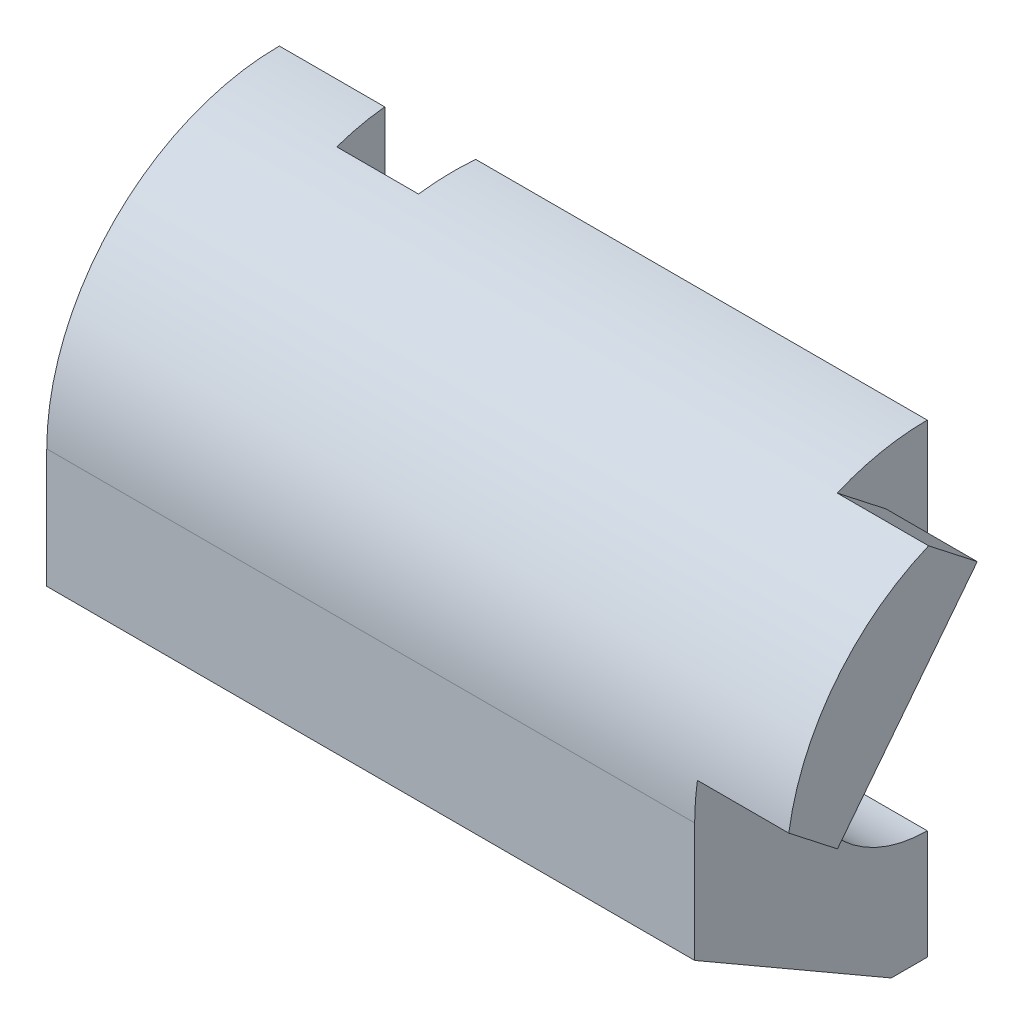
ISO-10303-21;
HEADER;
FILE_DESCRIPTION(('STEP AP214'),'2;1');
FILE_NAME('part.step','',(''),(''),'','','');
FILE_SCHEMA(('AUTOMOTIVE_DESIGN { 1 0 10303 214 1 1 1 1 }'));
ENDSEC;
DATA;
#1=APPLICATION_CONTEXT('core data for automotive mechanical design processes');
#2=APPLICATION_PROTOCOL_DEFINITION('international standard','automotive_design',2000,#1);
#3=PRODUCT_CONTEXT('',#1,'mechanical');
#4=PRODUCT('Part','Part','',(#3));
#5=PRODUCT_RELATED_PRODUCT_CATEGORY('part','',(#4));
#6=PRODUCT_DEFINITION_FORMATION('','',#4);
#7=PRODUCT_DEFINITION_CONTEXT('part definition',#1,'design');
#8=PRODUCT_DEFINITION('design','',#6,#7);
#9=PRODUCT_DEFINITION_SHAPE('','',#8);
#10=(LENGTH_UNIT() NAMED_UNIT(*) SI_UNIT(.MILLI.,.METRE.));
#11=(NAMED_UNIT(*) PLANE_ANGLE_UNIT() SI_UNIT($,.RADIAN.));
#12=(NAMED_UNIT(*) SI_UNIT($,.STERADIAN.) SOLID_ANGLE_UNIT());
#13=UNCERTAINTY_MEASURE_WITH_UNIT(LENGTH_MEASURE(1.E-05),#10,'distance_accuracy_value','');
#14=(GEOMETRIC_REPRESENTATION_CONTEXT(3) GLOBAL_UNCERTAINTY_ASSIGNED_CONTEXT((#13)) GLOBAL_UNIT_ASSIGNED_CONTEXT((#10,
#11,#12)) REPRESENTATION_CONTEXT('',''));
#15=CARTESIAN_POINT('',(0.,0.,0.));
#16=DIRECTION('',(0.,0.,1.));
#17=DIRECTION('',(1.,0.,0.));
#18=AXIS2_PLACEMENT_3D('',#15,#16,#17);
#19=CARTESIAN_POINT('',(234.,168.,0.));
#20=DIRECTION('',(0.,0.,1.));
#21=DIRECTION('',(1.,0.,0.));
#22=AXIS2_PLACEMENT_3D('',#19,#20,#21);
#23=PLANE('',#22);
#24=DIRECTION('',(-1.,0.,0.));
#25=VECTOR('',#24,1.);
#26=CARTESIAN_POINT('',(234.,168.,0.));
#27=LINE('',#26,#25);
#28=CARTESIAN_POINT('',(38.0874886635259,168.,0.));
#29=VERTEX_POINT('',#28);
#30=CARTESIAN_POINT('',(0.,168.,0.));
#31=VERTEX_POINT('',#30);
#32=EDGE_CURVE('E74',#29,#31,#27,.T.);
#33=ORIENTED_EDGE('',*,*,#32,.F.);
#34=DIRECTION('',(0.,-1.,0.));
#35=VECTOR('',#34,1.);
#36=CARTESIAN_POINT('',(38.0874886635259,168.,0.));
#37=LINE('',#36,#35);
#38=CARTESIAN_POINT('',(38.0874886635259,112.575,0.));
#39=VERTEX_POINT('',#38);
#40=EDGE_CURVE('E331',#29,#39,#37,.T.);
#41=ORIENTED_EDGE('',*,*,#40,.T.);
#42=DIRECTION('',(-1.,0.,0.));
#43=VECTOR('',#42,1.);
#44=CARTESIAN_POINT('',(234.,112.575,0.));
#45=LINE('',#44,#43);
#46=CARTESIAN_POINT('',(0.,112.575,0.));
#47=VERTEX_POINT('',#46);
#48=EDGE_CURVE('E317',#39,#47,#45,.T.);
#49=ORIENTED_EDGE('',*,*,#48,.T.);
#50=DIRECTION('',(0.,1.,0.));
#51=VECTOR('',#50,1.);
#52=CARTESIAN_POINT('',(0.,168.,0.));
#53=LINE('',#52,#51);
#54=EDGE_CURVE('E296',#47,#31,#53,.T.);
#55=ORIENTED_EDGE('',*,*,#54,.T.);
#56=EDGE_LOOP('',(#33,#41,#49,#55));
#57=FACE_BOUND('',#56,.T.);
#58=ADVANCED_FACE('F45',(#57),#23,.F.);
#59=CARTESIAN_POINT('',(234.,84.,0.));
#60=DIRECTION('',(-1.,0.,0.));
#61=DIRECTION('',(0.,0.,1.));
#62=AXIS2_PLACEMENT_3D('',#59,#60,#61);
#63=PLANE('',#62);
#64=DIRECTION('',(0.,0.615661475325659,0.788010753606721));
#65=VECTOR('',#64,1.);
#66=CARTESIAN_POINT('',(234.,147.707176139484,14.9464279455908));
#67=LINE('',#66,#65);
#68=CARTESIAN_POINT('',(234.,147.707176139484,14.9464279455908));
#69=VERTEX_POINT('',#68);
#70=CARTESIAN_POINT('',(234.,161.445287327106,32.5304084023249));
#71=VERTEX_POINT('',#70);
#72=EDGE_CURVE('E231',#69,#71,#67,.T.);
#73=ORIENTED_EDGE('',*,*,#72,.F.);
#74=DIRECTION('',(0.,0.788010753606721,-0.61566147532566));
#75=VECTOR('',#74,1.);
#76=CARTESIAN_POINT('',(234.,83.0902943437331,65.4306689222948));
#77=LINE('',#76,#75);
#78=CARTESIAN_POINT('',(234.,83.0902943437331,65.4306689222948));
#79=VERTEX_POINT('',#78);
#80=EDGE_CURVE('E241',#79,#69,#77,.T.);
#81=ORIENTED_EDGE('',*,*,#80,.F.);
#82=DIRECTION('',(0.,-0.61566147532566,-0.788010753606721));
#83=VECTOR('',#82,1.);
#84=CARTESIAN_POINT('',(234.,96.8284055313545,83.014649379029));
#85=LINE('',#84,#83);
#86=CARTESIAN_POINT('',(234.,96.8284055313545,83.014649379029));
#87=VERTEX_POINT('',#86);
#88=EDGE_CURVE('E238',#87,#79,#85,.T.);
#89=ORIENTED_EDGE('',*,*,#88,.F.);
#90=CARTESIAN_POINT('',(234.,84.,0.));
#91=DIRECTION('',(1.,0.,0.));
#92=DIRECTION('',(0.,0.,-1.));
#93=AXIS2_PLACEMENT_3D('',#90,#91,#92);
#94=CIRCLE('',#93,84.);
#95=CARTESIAN_POINT('',(234.,84.,84.));
#96=VERTEX_POINT('',#95);
#97=EDGE_CURVE('E280',#87,#96,#94,.T.);
#98=ORIENTED_EDGE('',*,*,#97,.T.);
#99=DIRECTION('',(0.,-1.,0.));
#100=VECTOR('',#99,1.);
#101=CARTESIAN_POINT('',(234.,40.9918691124635,84.));
#102=LINE('',#101,#100);
#103=CARTESIAN_POINT('',(234.,40.9918691124635,84.));
#104=VERTEX_POINT('',#103);
#105=EDGE_CURVE('E283',#96,#104,#102,.T.);
#106=ORIENTED_EDGE('',*,*,#105,.T.);
#107=DIRECTION('',(0.,-0.500000000000001,-0.866025403784438));
#108=VECTOR('',#107,1.);
#109=CARTESIAN_POINT('',(234.,0.,13.));
#110=LINE('',#109,#108);
#111=CARTESIAN_POINT('',(234.,0.,13.));
#112=VERTEX_POINT('',#111);
#113=EDGE_CURVE('E285',#104,#112,#110,.T.);
#114=ORIENTED_EDGE('',*,*,#113,.T.);
#115=DIRECTION('',(0.,0.,-1.));
#116=VECTOR('',#115,1.);
#117=CARTESIAN_POINT('',(234.,0.,0.));
#118=LINE('',#117,#116);
#119=CARTESIAN_POINT('',(234.,0.,0.));
#120=VERTEX_POINT('',#119);
#121=EDGE_CURVE('E287',#112,#120,#118,.T.);
#122=ORIENTED_EDGE('',*,*,#121,.T.);
#123=DIRECTION('',(0.,1.,0.));
#124=VECTOR('',#123,1.);
#125=CARTESIAN_POINT('',(234.,0.,0.));
#126=LINE('',#125,#124);
#127=CARTESIAN_POINT('',(234.,39.55,0.));
#128=VERTEX_POINT('',#127);
#129=EDGE_CURVE('E274',#120,#128,#126,.T.);
#130=ORIENTED_EDGE('',*,*,#129,.T.);
#131=CARTESIAN_POINT('',(234.,84.,0.));
#132=DIRECTION('',(1.,0.,0.));
#133=DIRECTION('',(0.,0.,1.));
#134=AXIS2_PLACEMENT_3D('',#131,#132,#133);
#135=CIRCLE('',#134,44.45);
#136=CARTESIAN_POINT('',(234.,128.45,0.));
#137=VERTEX_POINT('',#136);
#138=EDGE_CURVE('E258',#137,#128,#135,.T.);
#139=ORIENTED_EDGE('',*,*,#138,.F.);
#140=DIRECTION('',(0.,1.,0.));
#141=VECTOR('',#140,1.);
#142=CARTESIAN_POINT('',(234.,168.,0.));
#143=LINE('',#142,#141);
#144=CARTESIAN_POINT('',(234.,168.,0.));
#145=VERTEX_POINT('',#144);
#146=EDGE_CURVE('E277',#137,#145,#143,.T.);
#147=ORIENTED_EDGE('',*,*,#146,.T.);
#148=EDGE_CURVE('E281',#145,#71,#94,.T.);
#149=ORIENTED_EDGE('',*,*,#148,.T.);
#150=EDGE_LOOP('',(#73,#81,#89,#98,#106,#114,#122,#130,#139,#147,#149));
#151=FACE_BOUND('',#150,.T.);
#152=ADVANCED_FACE('F404',(#151),#63,.F.);
#153=CARTESIAN_POINT('',(234.,0.,0.));
#154=DIRECTION('',(0.,0.,1.));
#155=DIRECTION('',(1.,0.,0.));
#156=AXIS2_PLACEMENT_3D('',#153,#154,#155);
#157=PLANE('',#156);
#158=DIRECTION('',(0.,1.,0.));
#159=VECTOR('',#158,1.);
#160=CARTESIAN_POINT('',(0.,0.,0.));
#161=LINE('',#160,#159);
#162=CARTESIAN_POINT('',(0.,0.,0.));
#163=VERTEX_POINT('',#162);
#164=CARTESIAN_POINT('',(0.,15.,0.));
#165=VERTEX_POINT('',#164);
#166=EDGE_CURVE('E290',#163,#165,#161,.T.);
#167=ORIENTED_EDGE('',*,*,#166,.T.);
#168=DIRECTION('',(-1.,0.,0.));
#169=VECTOR('',#168,1.);
#170=CARTESIAN_POINT('',(0.,15.,0.));
#171=LINE('',#170,#169);
#172=CARTESIAN_POINT('',(117.,15.,0.));
#173=VERTEX_POINT('',#172);
#174=EDGE_CURVE('E215',#173,#165,#171,.T.);
#175=ORIENTED_EDGE('',*,*,#174,.F.);
#176=CARTESIAN_POINT('',(117.,26.,0.));
#177=DIRECTION('',(0.,0.,-1.));
#178=DIRECTION('',(-1.,0.,0.));
#179=AXIS2_PLACEMENT_3D('',#176,#177,#178);
#180=CIRCLE('',#179,11.);
#181=CARTESIAN_POINT('',(117.,37.,0.));
#182=VERTEX_POINT('',#181);
#183=EDGE_CURVE('E356',#182,#173,#180,.T.);
#184=ORIENTED_EDGE('',*,*,#183,.F.);
#185=DIRECTION('',(1.,0.,0.));
#186=VECTOR('',#185,1.);
#187=CARTESIAN_POINT('',(0.,37.,0.));
#188=LINE('',#187,#186);
#189=CARTESIAN_POINT('',(0.,37.,0.));
#190=VERTEX_POINT('',#189);
#191=EDGE_CURVE('E354',#190,#182,#188,.T.);
#192=ORIENTED_EDGE('',*,*,#191,.F.);
#193=CARTESIAN_POINT('',(0.,55.425,0.));
#194=VERTEX_POINT('',#193);
#195=EDGE_CURVE('E220',#190,#194,#161,.T.);
#196=ORIENTED_EDGE('',*,*,#195,.T.);
#197=DIRECTION('',(-1.,0.,0.));
#198=VECTOR('',#197,1.);
#199=CARTESIAN_POINT('',(234.,55.425,0.));
#200=LINE('',#199,#198);
#201=CARTESIAN_POINT('',(156.,55.425,0.));
#202=VERTEX_POINT('',#201);
#203=EDGE_CURVE('E205',#202,#194,#200,.T.);
#204=ORIENTED_EDGE('',*,*,#203,.F.);
#205=DIRECTION('',(0.,1.,0.));
#206=VECTOR('',#205,1.);
#207=CARTESIAN_POINT('',(156.,128.45,0.));
#208=LINE('',#207,#206);
#209=CARTESIAN_POINT('',(156.,39.55,0.));
#210=VERTEX_POINT('',#209);
#211=EDGE_CURVE('E263',#210,#202,#208,.T.);
#212=ORIENTED_EDGE('',*,*,#211,.F.);
#213=DIRECTION('',(1.,0.,0.));
#214=VECTOR('',#213,1.);
#215=CARTESIAN_POINT('',(156.,39.55,0.));
#216=LINE('',#215,#214);
#217=EDGE_CURVE('E265',#210,#128,#216,.T.);
#218=ORIENTED_EDGE('',*,*,#217,.T.);
#219=ORIENTED_EDGE('',*,*,#129,.F.);
#220=DIRECTION('',(-1.,0.,0.));
#221=VECTOR('',#220,1.);
#222=CARTESIAN_POINT('',(234.,0.,0.));
#223=LINE('',#222,#221);
#224=EDGE_CURVE('E289',#120,#163,#223,.T.);
#225=ORIENTED_EDGE('',*,*,#224,.T.);
#226=EDGE_LOOP('',(#167,#175,#184,#192,#196,#204,#212,#218,#219,#225));
#227=FACE_BOUND('',#226,.T.);
#228=ADVANCED_FACE('F370',(#227),#157,.F.);
#229=CARTESIAN_POINT('',(234.,84.,0.));
#230=DIRECTION('',(-1.,0.,0.));
#231=DIRECTION('',(0.,0.,1.));
#232=AXIS2_PLACEMENT_3D('',#229,#230,#231);
#233=CYLINDRICAL_SURFACE('',#232,28.575);
#234=ORIENTED_EDGE('',*,*,#48,.F.);
#235=CARTESIAN_POINT('',(38.0874886635259,84.,0.));
#236=DIRECTION('',(-0.996194698091745,0.,0.0871557427476653));
#237=DIRECTION('',(-0.0871557427476653,0.,-0.996194698091745));
#238=AXIS2_PLACEMENT_3D('',#235,#236,#237);
#239=ELLIPSE('',#238,28.6841518578012,28.575);
#240=CARTESIAN_POINT('',(39.7497732705186,105.343163425322,19.));
#241=VERTEX_POINT('',#240);
#242=EDGE_CURVE('E333',#39,#241,#239,.F.);
#243=ORIENTED_EDGE('',*,*,#242,.T.);
#244=DIRECTION('',(-1.,0.,0.));
#245=VECTOR('',#244,1.);
#246=CARTESIAN_POINT('',(234.,105.343163425322,19.));
#247=LINE('',#246,#245);
#248=CARTESIAN_POINT('',(69.2502267294814,105.343163425322,19.));
#249=VERTEX_POINT('',#248);
#250=EDGE_CURVE('E349',#249,#241,#247,.T.);
#251=ORIENTED_EDGE('',*,*,#250,.F.);
#252=CARTESIAN_POINT('',(70.9125113364741,84.,0.));
#253=DIRECTION('',(0.996194698091745,0.,0.0871557427476656));
#254=DIRECTION('',(-0.0871557427476656,0.,0.996194698091745));
#255=AXIS2_PLACEMENT_3D('',#252,#253,#254);
#256=ELLIPSE('',#255,28.6841518578012,28.575);
#257=CARTESIAN_POINT('',(70.9125113364741,112.575,0.));
#258=VERTEX_POINT('',#257);
#259=EDGE_CURVE('E335',#249,#258,#256,.F.);
#260=ORIENTED_EDGE('',*,*,#259,.T.);
#261=CARTESIAN_POINT('',(156.,112.575,0.));
#262=VERTEX_POINT('',#261);
#263=EDGE_CURVE('E318',#262,#258,#45,.T.);
#264=ORIENTED_EDGE('',*,*,#263,.F.);
#265=CARTESIAN_POINT('',(156.,84.,0.));
#266=DIRECTION('',(-1.,0.,0.));
#267=DIRECTION('',(0.,0.,1.));
#268=AXIS2_PLACEMENT_3D('',#265,#266,#267);
#269=CIRCLE('',#268,28.575);
#270=EDGE_CURVE('E269',#262,#202,#269,.F.);
#271=ORIENTED_EDGE('',*,*,#270,.T.);
#272=ORIENTED_EDGE('',*,*,#203,.T.);
#273=CARTESIAN_POINT('',(0.,84.,0.));
#274=DIRECTION('',(-1.,0.,0.));
#275=DIRECTION('',(0.,0.,1.));
#276=AXIS2_PLACEMENT_3D('',#273,#274,#275);
#277=CIRCLE('',#276,28.575);
#278=EDGE_CURVE('E293',#194,#47,#277,.T.);
#279=ORIENTED_EDGE('',*,*,#278,.T.);
#280=EDGE_LOOP('',(#234,#243,#251,#260,#264,#271,#272,#279));
#281=FACE_BOUND('',#280,.T.);
#282=ADVANCED_FACE('F352',(#281),#233,.F.);
#283=ORIENTED_EDGE('',*,*,#263,.T.);
#284=DIRECTION('',(0.,1.,0.));
#285=VECTOR('',#284,1.);
#286=CARTESIAN_POINT('',(70.9125113364741,168.,0.));
#287=LINE('',#286,#285);
#288=CARTESIAN_POINT('',(70.9125113364741,168.,0.));
#289=VERTEX_POINT('',#288);
#290=EDGE_CURVE('E55',#258,#289,#287,.T.);
#291=ORIENTED_EDGE('',*,*,#290,.T.);
#292=EDGE_CURVE('E61',#145,#289,#27,.T.);
#293=ORIENTED_EDGE('',*,*,#292,.F.);
#294=ORIENTED_EDGE('',*,*,#146,.F.);
#295=DIRECTION('',(1.,0.,0.));
#296=VECTOR('',#295,1.);
#297=CARTESIAN_POINT('',(156.,128.45,0.));
#298=LINE('',#297,#296);
#299=CARTESIAN_POINT('',(156.,128.45,0.));
#300=VERTEX_POINT('',#299);
#301=EDGE_CURVE('E267',#300,#137,#298,.T.);
#302=ORIENTED_EDGE('',*,*,#301,.F.);
#303=EDGE_CURVE('E262',#262,#300,#208,.T.);
#304=ORIENTED_EDGE('',*,*,#303,.F.);
#305=EDGE_LOOP('',(#283,#291,#293,#294,#302,#304));
#306=FACE_BOUND('',#305,.T.);
#307=ADVANCED_FACE('F339',(#306),#23,.F.);
#308=CARTESIAN_POINT('',(234.,84.,0.));
#309=DIRECTION('',(-1.,0.,0.));
#310=DIRECTION('',(0.,0.,1.));
#311=AXIS2_PLACEMENT_3D('',#308,#309,#310);
#312=CYLINDRICAL_SURFACE('',#311,84.);
#313=DIRECTION('',(-1.,0.,0.));
#314=VECTOR('',#313,1.);
#315=CARTESIAN_POINT('',(234.,165.822979657307,19.));
#316=LINE('',#315,#314);
#317=CARTESIAN_POINT('',(39.7497732705186,165.822979657307,19.));
#318=VERTEX_POINT('',#317);
#319=CARTESIAN_POINT('',(69.2502267294814,165.822979657307,19.));
#320=VERTEX_POINT('',#319);
#321=EDGE_CURVE('E204',#318,#320,#316,.F.);
#322=ORIENTED_EDGE('',*,*,#321,.F.);
#323=CARTESIAN_POINT('',(38.0874886635259,84.,0.));
#324=DIRECTION('',(-0.996194698091745,0.,0.0871557427476653));
#325=DIRECTION('',(-0.0871557427476653,0.,-0.996194698091745));
#326=AXIS2_PLACEMENT_3D('',#323,#324,#325);
#327=ELLIPSE('',#326,84.3208663536413,84.);
#328=EDGE_CURVE('E329',#318,#29,#327,.T.);
#329=ORIENTED_EDGE('',*,*,#328,.T.);
#330=ORIENTED_EDGE('',*,*,#32,.T.);
#331=CARTESIAN_POINT('',(0.,84.,0.));
#332=DIRECTION('',(1.,0.,0.));
#333=DIRECTION('',(0.,0.,-1.));
#334=AXIS2_PLACEMENT_3D('',#331,#332,#333);
#335=CIRCLE('',#334,84.);
#336=CARTESIAN_POINT('',(0.,84.,84.));
#337=VERTEX_POINT('',#336);
#338=EDGE_CURVE('E298',#31,#337,#335,.T.);
#339=ORIENTED_EDGE('',*,*,#338,.T.);
#340=DIRECTION('',(-1.,0.,0.));
#341=VECTOR('',#340,1.);
#342=CARTESIAN_POINT('',(234.,84.,84.));
#343=LINE('',#342,#341);
#344=EDGE_CURVE('E313',#96,#337,#343,.T.);
#345=ORIENTED_EDGE('',*,*,#344,.F.);
#346=ORIENTED_EDGE('',*,*,#97,.F.);
#347=DIRECTION('',(-1.,0.,0.));
#348=VECTOR('',#347,1.);
#349=CARTESIAN_POINT('',(267.,96.8284055313545,83.014649379029));
#350=LINE('',#349,#348);
#351=CARTESIAN_POINT('',(267.,96.8284055313545,83.014649379029));
#352=VERTEX_POINT('',#351);
#353=EDGE_CURVE('E255',#352,#87,#350,.T.);
#354=ORIENTED_EDGE('',*,*,#353,.F.);
#355=CARTESIAN_POINT('',(267.,84.,0.));
#356=DIRECTION('',(1.,0.,0.));
#357=DIRECTION('',(0.,0.,1.));
#358=AXIS2_PLACEMENT_3D('',#355,#356,#357);
#359=CIRCLE('',#358,84.);
#360=CARTESIAN_POINT('',(267.,161.445287327106,32.5304084023249));
#361=VERTEX_POINT('',#360);
#362=EDGE_CURVE('E227',#361,#352,#359,.T.);
#363=ORIENTED_EDGE('',*,*,#362,.F.);
#364=DIRECTION('',(-1.,0.,0.));
#365=VECTOR('',#364,1.);
#366=CARTESIAN_POINT('',(267.,161.445287327106,32.5304084023249));
#367=LINE('',#366,#365);
#368=EDGE_CURVE('E237',#361,#71,#367,.T.);
#369=ORIENTED_EDGE('',*,*,#368,.T.);
#370=ORIENTED_EDGE('',*,*,#148,.F.);
#371=ORIENTED_EDGE('',*,*,#292,.T.);
#372=CARTESIAN_POINT('',(70.9125113364741,84.,0.));
#373=DIRECTION('',(0.996194698091745,0.,0.0871557427476656));
#374=DIRECTION('',(-0.0871557427476656,0.,0.996194698091745));
#375=AXIS2_PLACEMENT_3D('',#372,#373,#374);
#376=ELLIPSE('',#375,84.3208663536413,84.);
#377=EDGE_CURVE('E11',#289,#320,#376,.T.);
#378=ORIENTED_EDGE('',*,*,#377,.T.);
#379=EDGE_LOOP('',(#322,#329,#330,#339,#345,#346,#354,#363,#369,#370,#371,#378));
#380=FACE_BOUND('',#379,.T.);
#381=ADVANCED_FACE('F391',(#380),#312,.T.);
#382=CARTESIAN_POINT('',(234.,40.9918691124635,84.));
#383=DIRECTION('',(0.,0.,-1.));
#384=DIRECTION('',(0.,1.,0.));
#385=AXIS2_PLACEMENT_3D('',#382,#383,#384);
#386=PLANE('',#385);
#387=DIRECTION('',(0.,-1.,0.));
#388=VECTOR('',#387,1.);
#389=CARTESIAN_POINT('',(0.,40.9918691124635,84.));
#390=LINE('',#389,#388);
#391=CARTESIAN_POINT('',(0.,40.9918691124635,84.));
#392=VERTEX_POINT('',#391);
#393=EDGE_CURVE('E300',#337,#392,#390,.T.);
#394=ORIENTED_EDGE('',*,*,#393,.T.);
#395=DIRECTION('',(-1.,0.,0.));
#396=VECTOR('',#395,1.);
#397=CARTESIAN_POINT('',(234.,40.9918691124635,84.));
#398=LINE('',#397,#396);
#399=EDGE_CURVE('E310',#104,#392,#398,.T.);
#400=ORIENTED_EDGE('',*,*,#399,.F.);
#401=ORIENTED_EDGE('',*,*,#105,.F.);
#402=ORIENTED_EDGE('',*,*,#344,.T.);
#403=EDGE_LOOP('',(#394,#400,#401,#402));
#404=FACE_BOUND('',#403,.T.);
#405=ADVANCED_FACE('F387',(#404),#386,.F.);
#406=CARTESIAN_POINT('',(234.,0.,13.));
#407=DIRECTION('',(0.,0.866025403784438,-0.500000000000001));
#408=DIRECTION('',(0.,0.500000000000001,0.866025403784438));
#409=AXIS2_PLACEMENT_3D('',#406,#407,#408);
#410=PLANE('',#409);
#411=DIRECTION('',(0.,-0.500000000000001,-0.866025403784438));
#412=VECTOR('',#411,1.);
#413=CARTESIAN_POINT('',(0.,0.,13.));
#414=LINE('',#413,#412);
#415=CARTESIAN_POINT('',(0.,0.,13.));
#416=VERTEX_POINT('',#415);
#417=EDGE_CURVE('E302',#392,#416,#414,.T.);
#418=ORIENTED_EDGE('',*,*,#417,.T.);
#419=DIRECTION('',(-1.,0.,0.));
#420=VECTOR('',#419,1.);
#421=CARTESIAN_POINT('',(234.,0.,13.));
#422=LINE('',#421,#420);
#423=EDGE_CURVE('E307',#112,#416,#422,.T.);
#424=ORIENTED_EDGE('',*,*,#423,.F.);
#425=ORIENTED_EDGE('',*,*,#113,.F.);
#426=ORIENTED_EDGE('',*,*,#399,.T.);
#427=EDGE_LOOP('',(#418,#424,#425,#426));
#428=FACE_BOUND('',#427,.T.);
#429=ADVANCED_FACE('F383',(#428),#410,.F.);
#430=CARTESIAN_POINT('',(234.,0.,0.));
#431=DIRECTION('',(0.,1.,0.));
#432=DIRECTION('',(0.,0.,1.));
#433=AXIS2_PLACEMENT_3D('',#430,#431,#432);
#434=PLANE('',#433);
#435=DIRECTION('',(0.,0.,-1.));
#436=VECTOR('',#435,1.);
#437=CARTESIAN_POINT('',(0.,0.,0.));
#438=LINE('',#437,#436);
#439=EDGE_CURVE('E278',#416,#163,#438,.T.);
#440=ORIENTED_EDGE('',*,*,#439,.T.);
#441=ORIENTED_EDGE('',*,*,#224,.F.);
#442=ORIENTED_EDGE('',*,*,#121,.F.);
#443=ORIENTED_EDGE('',*,*,#423,.T.);
#444=EDGE_LOOP('',(#440,#441,#442,#443));
#445=FACE_BOUND('',#444,.T.);
#446=ADVANCED_FACE('F378',(#445),#434,.F.);
#447=CARTESIAN_POINT('',(0.,84.,0.));
#448=DIRECTION('',(-1.,0.,0.));
#449=DIRECTION('',(0.,0.,1.));
#450=AXIS2_PLACEMENT_3D('',#447,#448,#449);
#451=PLANE('',#450);
#452=DIRECTION('',(0.,0.,-1.));
#453=VECTOR('',#452,1.);
#454=CARTESIAN_POINT('',(0.,15.,13.));
#455=LINE('',#454,#453);
#456=CARTESIAN_POINT('',(0.,15.,13.));
#457=VERTEX_POINT('',#456);
#458=EDGE_CURVE('E242',#457,#165,#455,.T.);
#459=ORIENTED_EDGE('',*,*,#458,.T.);
#460=ORIENTED_EDGE('',*,*,#166,.F.);
#461=ORIENTED_EDGE('',*,*,#439,.F.);
#462=ORIENTED_EDGE('',*,*,#417,.F.);
#463=ORIENTED_EDGE('',*,*,#393,.F.);
#464=ORIENTED_EDGE('',*,*,#338,.F.);
#465=ORIENTED_EDGE('',*,*,#54,.F.);
#466=ORIENTED_EDGE('',*,*,#278,.F.);
#467=ORIENTED_EDGE('',*,*,#195,.F.);
#468=DIRECTION('',(0.,0.,-1.));
#469=VECTOR('',#468,1.);
#470=CARTESIAN_POINT('',(0.,37.,13.));
#471=LINE('',#470,#469);
#472=CARTESIAN_POINT('',(0.,37.,13.));
#473=VERTEX_POINT('',#472);
#474=EDGE_CURVE('E210',#473,#190,#471,.T.);
#475=ORIENTED_EDGE('',*,*,#474,.F.);
#476=DIRECTION('',(0.,-1.,0.));
#477=VECTOR('',#476,1.);
#478=CARTESIAN_POINT('',(0.,84.,13.));
#479=LINE('',#478,#477);
#480=EDGE_CURVE('E193',#473,#457,#479,.T.);
#481=ORIENTED_EDGE('',*,*,#480,.T.);
#482=EDGE_LOOP('',(#459,#460,#461,#462,#463,#464,#465,#466,#467,#475,#481));
#483=FACE_BOUND('',#482,.T.);
#484=ADVANCED_FACE('F218',(#483),#451,.T.);
#485=CARTESIAN_POINT('',(156.,84.,0.));
#486=DIRECTION('',(-1.,0.,0.));
#487=DIRECTION('',(0.,0.,1.));
#488=AXIS2_PLACEMENT_3D('',#485,#486,#487);
#489=PLANE('',#488);
#490=ORIENTED_EDGE('',*,*,#303,.T.);
#491=CARTESIAN_POINT('',(156.,84.,0.));
#492=DIRECTION('',(1.,0.,0.));
#493=DIRECTION('',(0.,0.,1.));
#494=AXIS2_PLACEMENT_3D('',#491,#492,#493);
#495=CIRCLE('',#494,44.45);
#496=EDGE_CURVE('E259',#300,#210,#495,.T.);
#497=ORIENTED_EDGE('',*,*,#496,.T.);
#498=ORIENTED_EDGE('',*,*,#211,.T.);
#499=ORIENTED_EDGE('',*,*,#270,.F.);
#500=EDGE_LOOP('',(#490,#497,#498,#499));
#501=FACE_BOUND('',#500,.T.);
#502=ADVANCED_FACE('F397',(#501),#489,.F.);
#503=CARTESIAN_POINT('',(156.,84.,0.));
#504=DIRECTION('',(1.,0.,0.));
#505=DIRECTION('',(0.,0.,-1.));
#506=AXIS2_PLACEMENT_3D('',#503,#504,#505);
#507=CYLINDRICAL_SURFACE('',#506,44.45);
#508=ORIENTED_EDGE('',*,*,#138,.T.);
#509=ORIENTED_EDGE('',*,*,#217,.F.);
#510=ORIENTED_EDGE('',*,*,#496,.F.);
#511=ORIENTED_EDGE('',*,*,#301,.T.);
#512=EDGE_LOOP('',(#508,#509,#510,#511));
#513=FACE_BOUND('',#512,.T.);
#514=ADVANCED_FACE('F401',(#513),#507,.F.);
#515=CARTESIAN_POINT('',(267.,96.8284055313545,83.014649379029));
#516=DIRECTION('',(0.,0.788010753606721,-0.61566147532566));
#517=DIRECTION('',(0.,0.61566147532566,0.788010753606721));
#518=AXIS2_PLACEMENT_3D('',#515,#516,#517);
#519=PLANE('',#518);
#520=ORIENTED_EDGE('',*,*,#88,.T.);
#521=DIRECTION('',(-1.,0.,0.));
#522=VECTOR('',#521,1.);
#523=CARTESIAN_POINT('',(267.,83.0902943437331,65.4306689222948));
#524=LINE('',#523,#522);
#525=CARTESIAN_POINT('',(267.,83.0902943437331,65.4306689222948));
#526=VERTEX_POINT('',#525);
#527=EDGE_CURVE('E252',#526,#79,#524,.T.);
#528=ORIENTED_EDGE('',*,*,#527,.F.);
#529=DIRECTION('',(0.,-0.61566147532566,-0.788010753606721));
#530=VECTOR('',#529,1.);
#531=CARTESIAN_POINT('',(267.,96.8284055313545,83.014649379029));
#532=LINE('',#531,#530);
#533=EDGE_CURVE('E230',#352,#526,#532,.T.);
#534=ORIENTED_EDGE('',*,*,#533,.F.);
#535=ORIENTED_EDGE('',*,*,#353,.T.);
#536=EDGE_LOOP('',(#520,#528,#534,#535));
#537=FACE_BOUND('',#536,.T.);
#538=ADVANCED_FACE('F408',(#537),#519,.F.);
#539=CARTESIAN_POINT('',(267.,83.0902943437331,65.4306689222948));
#540=DIRECTION('',(0.,0.615661475325659,0.788010753606721));
#541=DIRECTION('',(0.,-0.788010753606721,0.615661475325659));
#542=AXIS2_PLACEMENT_3D('',#539,#540,#541);
#543=PLANE('',#542);
#544=ORIENTED_EDGE('',*,*,#80,.T.);
#545=DIRECTION('',(-1.,0.,0.));
#546=VECTOR('',#545,1.);
#547=CARTESIAN_POINT('',(267.,147.707176139484,14.9464279455908));
#548=LINE('',#547,#546);
#549=CARTESIAN_POINT('',(267.,147.707176139484,14.9464279455908));
#550=VERTEX_POINT('',#549);
#551=EDGE_CURVE('E249',#550,#69,#548,.T.);
#552=ORIENTED_EDGE('',*,*,#551,.F.);
#553=DIRECTION('',(0.,0.788010753606721,-0.61566147532566));
#554=VECTOR('',#553,1.);
#555=CARTESIAN_POINT('',(267.,83.0902943437331,65.4306689222948));
#556=LINE('',#555,#554);
#557=EDGE_CURVE('E233',#526,#550,#556,.T.);
#558=ORIENTED_EDGE('',*,*,#557,.F.);
#559=ORIENTED_EDGE('',*,*,#527,.T.);
#560=EDGE_LOOP('',(#544,#552,#558,#559));
#561=FACE_BOUND('',#560,.T.);
#562=ADVANCED_FACE('F419',(#561),#543,.F.);
#563=CARTESIAN_POINT('',(267.,147.707176139484,14.9464279455908));
#564=DIRECTION('',(0.,-0.788010753606721,0.615661475325659));
#565=DIRECTION('',(0.,-0.615661475325659,-0.788010753606721));
#566=AXIS2_PLACEMENT_3D('',#563,#564,#565);
#567=PLANE('',#566);
#568=ORIENTED_EDGE('',*,*,#72,.T.);
#569=ORIENTED_EDGE('',*,*,#368,.F.);
#570=DIRECTION('',(0.,0.615661475325659,0.788010753606721));
#571=VECTOR('',#570,1.);
#572=CARTESIAN_POINT('',(267.,147.707176139484,14.9464279455908));
#573=LINE('',#572,#571);
#574=EDGE_CURVE('E235',#550,#361,#573,.T.);
#575=ORIENTED_EDGE('',*,*,#574,.F.);
#576=ORIENTED_EDGE('',*,*,#551,.T.);
#577=EDGE_LOOP('',(#568,#569,#575,#576));
#578=FACE_BOUND('',#577,.T.);
#579=ADVANCED_FACE('F416',(#578),#567,.F.);
#580=CARTESIAN_POINT('',(267.,84.,0.));
#581=DIRECTION('',(-1.,0.,0.));
#582=DIRECTION('',(0.,0.,1.));
#583=AXIS2_PLACEMENT_3D('',#580,#581,#582);
#584=PLANE('',#583);
#585=ORIENTED_EDGE('',*,*,#362,.T.);
#586=ORIENTED_EDGE('',*,*,#533,.T.);
#587=ORIENTED_EDGE('',*,*,#557,.T.);
#588=ORIENTED_EDGE('',*,*,#574,.T.);
#589=EDGE_LOOP('',(#585,#586,#587,#588));
#590=FACE_BOUND('',#589,.T.);
#591=ADVANCED_FACE('F412',(#590),#584,.F.);
#592=CARTESIAN_POINT('',(0.,15.,13.));
#593=DIRECTION('',(0.,-1.,0.));
#594=DIRECTION('',(1.,0.,0.));
#595=AXIS2_PLACEMENT_3D('',#592,#593,#594);
#596=PLANE('',#595);
#597=ORIENTED_EDGE('',*,*,#174,.T.);
#598=ORIENTED_EDGE('',*,*,#458,.F.);
#599=DIRECTION('',(-1.,0.,0.));
#600=VECTOR('',#599,1.);
#601=CARTESIAN_POINT('',(0.,15.,13.));
#602=LINE('',#601,#600);
#603=CARTESIAN_POINT('',(117.,15.,13.));
#604=VERTEX_POINT('',#603);
#605=EDGE_CURVE('E199',#604,#457,#602,.T.);
#606=ORIENTED_EDGE('',*,*,#605,.F.);
#607=DIRECTION('',(0.,0.,-1.));
#608=VECTOR('',#607,1.);
#609=CARTESIAN_POINT('',(117.,15.,13.));
#610=LINE('',#609,#608);
#611=EDGE_CURVE('E222',#604,#173,#610,.T.);
#612=ORIENTED_EDGE('',*,*,#611,.T.);
#613=EDGE_LOOP('',(#597,#598,#606,#612));
#614=FACE_BOUND('',#613,.T.);
#615=ADVANCED_FACE('F364',(#614),#596,.F.);
#616=CARTESIAN_POINT('',(117.,26.,13.));
#617=DIRECTION('',(0.,0.,-1.));
#618=DIRECTION('',(-1.,0.,0.));
#619=AXIS2_PLACEMENT_3D('',#616,#617,#618);
#620=CYLINDRICAL_SURFACE('',#619,11.);
#621=ORIENTED_EDGE('',*,*,#183,.T.);
#622=ORIENTED_EDGE('',*,*,#611,.F.);
#623=CARTESIAN_POINT('',(117.,26.,13.));
#624=DIRECTION('',(0.,0.,-1.));
#625=DIRECTION('',(-1.,0.,0.));
#626=AXIS2_PLACEMENT_3D('',#623,#624,#625);
#627=CIRCLE('',#626,11.);
#628=CARTESIAN_POINT('',(117.,37.,13.));
#629=VERTEX_POINT('',#628);
#630=EDGE_CURVE('E214',#629,#604,#627,.T.);
#631=ORIENTED_EDGE('',*,*,#630,.F.);
#632=DIRECTION('',(0.,0.,-1.));
#633=VECTOR('',#632,1.);
#634=CARTESIAN_POINT('',(117.,37.,13.));
#635=LINE('',#634,#633);
#636=EDGE_CURVE('E212',#629,#182,#635,.T.);
#637=ORIENTED_EDGE('',*,*,#636,.T.);
#638=EDGE_LOOP('',(#621,#622,#631,#637));
#639=FACE_BOUND('',#638,.T.);
#640=ADVANCED_FACE('F368',(#639),#620,.F.);
#641=CARTESIAN_POINT('',(0.,37.,13.));
#642=DIRECTION('',(0.,1.,0.));
#643=DIRECTION('',(-1.,0.,0.));
#644=AXIS2_PLACEMENT_3D('',#641,#642,#643);
#645=PLANE('',#644);
#646=ORIENTED_EDGE('',*,*,#191,.T.);
#647=ORIENTED_EDGE('',*,*,#636,.F.);
#648=DIRECTION('',(1.,0.,0.));
#649=VECTOR('',#648,1.);
#650=CARTESIAN_POINT('',(0.,37.,13.));
#651=LINE('',#650,#649);
#652=EDGE_CURVE('E197',#473,#629,#651,.T.);
#653=ORIENTED_EDGE('',*,*,#652,.F.);
#654=ORIENTED_EDGE('',*,*,#474,.T.);
#655=EDGE_LOOP('',(#646,#647,#653,#654));
#656=FACE_BOUND('',#655,.T.);
#657=ADVANCED_FACE('F209',(#656),#645,.F.);
#658=CARTESIAN_POINT('',(0.,26.,13.));
#659=DIRECTION('',(0.,0.,-1.));
#660=DIRECTION('',(-1.,0.,0.));
#661=AXIS2_PLACEMENT_3D('',#658,#659,#660);
#662=PLANE('',#661);
#663=ORIENTED_EDGE('',*,*,#652,.T.);
#664=ORIENTED_EDGE('',*,*,#630,.T.);
#665=ORIENTED_EDGE('',*,*,#605,.T.);
#666=ORIENTED_EDGE('',*,*,#480,.F.);
#667=EDGE_LOOP('',(#663,#664,#665,#666));
#668=FACE_BOUND('',#667,.T.);
#669=ADVANCED_FACE('F195',(#668),#662,.T.);
#670=CARTESIAN_POINT('',(0.,0.,19.));
#671=DIRECTION('',(0.,0.,-1.));
#672=DIRECTION('',(-1.,0.,0.));
#673=AXIS2_PLACEMENT_3D('',#670,#671,#672);
#674=PLANE('',#673);
#675=ORIENTED_EDGE('',*,*,#250,.T.);
#676=DIRECTION('',(0.,1.,0.));
#677=VECTOR('',#676,1.);
#678=CARTESIAN_POINT('',(39.7497732705186,0.,19.));
#679=LINE('',#678,#677);
#680=EDGE_CURVE('E326',#241,#318,#679,.T.);
#681=ORIENTED_EDGE('',*,*,#680,.T.);
#682=ORIENTED_EDGE('',*,*,#321,.T.);
#683=DIRECTION('',(0.,-1.,0.));
#684=VECTOR('',#683,1.);
#685=CARTESIAN_POINT('',(69.2502267294814,0.,19.));
#686=LINE('',#685,#684);
#687=EDGE_CURVE('E323',#320,#249,#686,.T.);
#688=ORIENTED_EDGE('',*,*,#687,.T.);
#689=EDGE_LOOP('',(#675,#681,#682,#688));
#690=FACE_BOUND('',#689,.T.);
#691=ADVANCED_FACE('F348',(#690),#674,.T.);
#692=CARTESIAN_POINT('',(39.7497732705186,0.,19.));
#693=DIRECTION('',(-0.996194698091745,0.,0.0871557427476653));
#694=DIRECTION('',(0.,1.,0.));
#695=AXIS2_PLACEMENT_3D('',#692,#693,#694);
#696=PLANE('',#695);
#697=ORIENTED_EDGE('',*,*,#242,.F.);
#698=ORIENTED_EDGE('',*,*,#40,.F.);
#699=ORIENTED_EDGE('',*,*,#328,.F.);
#700=ORIENTED_EDGE('',*,*,#680,.F.);
#701=EDGE_LOOP('',(#697,#698,#699,#700));
#702=FACE_BOUND('',#701,.T.);
#703=ADVANCED_FACE('F447',(#702),#696,.F.);
#704=CARTESIAN_POINT('',(69.2502267294814,0.,19.));
#705=DIRECTION('',(0.996194698091745,0.,0.0871557427476656));
#706=DIRECTION('',(0.,-1.,0.));
#707=AXIS2_PLACEMENT_3D('',#704,#705,#706);
#708=PLANE('',#707);
#709=ORIENTED_EDGE('',*,*,#377,.F.);
#710=ORIENTED_EDGE('',*,*,#290,.F.);
#711=ORIENTED_EDGE('',*,*,#259,.F.);
#712=ORIENTED_EDGE('',*,*,#687,.F.);
#713=EDGE_LOOP('',(#709,#710,#711,#712));
#714=FACE_BOUND('',#713,.T.);
#715=ADVANCED_FACE('F48',(#714),#708,.F.);
#716=CLOSED_SHELL('',(#58,#152,#228,#282,#307,#381,#405,#429,#446,#484,#502,#514,#538,#562,#579,
#591,#615,#640,#657,#669,#691,#703,#715));
#717=MANIFOLD_SOLID_BREP('B2',#716);
#718=ADVANCED_BREP_SHAPE_REPRESENTATION('',(#18,#717),#14);
#719=SHAPE_DEFINITION_REPRESENTATION(#9,#718);
ENDSEC;
END-ISO-10303-21;
